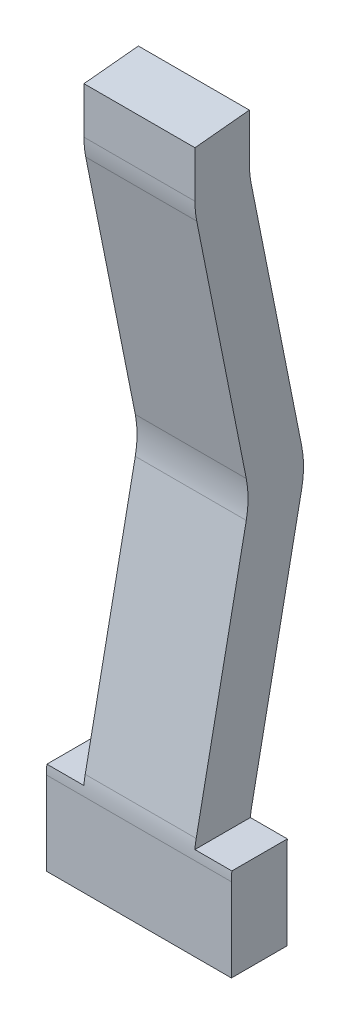
ISO-10303-21;
HEADER;
FILE_DESCRIPTION(('STEP AP214'),'2;1');
FILE_NAME('part.step','',(''),(''),'','','');
FILE_SCHEMA(('AUTOMOTIVE_DESIGN { 1 0 10303 214 1 1 1 1 }'));
ENDSEC;
DATA;
#1=APPLICATION_CONTEXT('core data for automotive mechanical design processes');
#2=APPLICATION_PROTOCOL_DEFINITION('international standard','automotive_design',2000,#1);
#3=PRODUCT_CONTEXT('',#1,'mechanical');
#4=PRODUCT('Part','Part','',(#3));
#5=PRODUCT_RELATED_PRODUCT_CATEGORY('part','',(#4));
#6=PRODUCT_DEFINITION_FORMATION('','',#4);
#7=PRODUCT_DEFINITION_CONTEXT('part definition',#1,'design');
#8=PRODUCT_DEFINITION('design','',#6,#7);
#9=PRODUCT_DEFINITION_SHAPE('','',#8);
#10=(LENGTH_UNIT() NAMED_UNIT(*) SI_UNIT(.MILLI.,.METRE.));
#11=(NAMED_UNIT(*) PLANE_ANGLE_UNIT() SI_UNIT($,.RADIAN.));
#12=(NAMED_UNIT(*) SI_UNIT($,.STERADIAN.) SOLID_ANGLE_UNIT());
#13=UNCERTAINTY_MEASURE_WITH_UNIT(LENGTH_MEASURE(1.E-05),#10,'distance_accuracy_value','');
#14=(GEOMETRIC_REPRESENTATION_CONTEXT(3) GLOBAL_UNCERTAINTY_ASSIGNED_CONTEXT((#13)) GLOBAL_UNIT_ASSIGNED_CONTEXT((#10,
#11,#12)) REPRESENTATION_CONTEXT('',''));
#15=CARTESIAN_POINT('',(0.,0.,0.));
#16=DIRECTION('',(0.,0.,1.));
#17=DIRECTION('',(1.,0.,0.));
#18=AXIS2_PLACEMENT_3D('',#15,#16,#17);
#19=CARTESIAN_POINT('',(0.4,0.450490243203608,-0.35));
#20=DIRECTION('',(1.,0.,0.));
#21=DIRECTION('',(0.,0.0985376179666422,0.99513332666807));
#22=AXIS2_PLACEMENT_3D('',#19,#20,#21);
#23=CYLINDRICAL_SURFACE('',#22,0.5);
#24=CARTESIAN_POINT('',(-0.3,0.450490243203608,-0.35));
#25=DIRECTION('',(-1.,0.,0.));
#26=DIRECTION('',(0.,0.0985376179666422,0.99513332666807));
#27=AXIS2_PLACEMENT_3D('',#24,#25,#26);
#28=CIRCLE('',#27,0.5);
#29=CARTESIAN_POINT('',(-0.3,0.5,0.147542745884173));
#30=VERTEX_POINT('',#29);
#31=CARTESIAN_POINT('',(-0.3,0.5485483107727,0.14029033784546));
#32=VERTEX_POINT('',#31);
#33=EDGE_CURVE('E308',#30,#32,#28,.T.);
#34=ORIENTED_EDGE('',*,*,#33,.F.);
#35=DIRECTION('',(1.,0.,0.));
#36=VECTOR('',#35,1.);
#37=CARTESIAN_POINT('',(0.4,0.5,0.147542745884173));
#38=LINE('',#37,#36);
#39=CARTESIAN_POINT('',(-0.5,0.5,0.147542745884173));
#40=VERTEX_POINT('',#39);
#41=EDGE_CURVE('E40',#40,#30,#38,.T.);
#42=ORIENTED_EDGE('',*,*,#41,.F.);
#43=CARTESIAN_POINT('',(-0.5,0.450490243203608,-0.35));
#44=DIRECTION('',(-1.,0.,0.));
#45=DIRECTION('',(0.,0.0985376179666422,0.99513332666807));
#46=AXIS2_PLACEMENT_3D('',#43,#44,#45);
#47=CIRCLE('',#46,0.5);
#48=CARTESIAN_POINT('',(-0.5,0.450490243203608,0.15));
#49=VERTEX_POINT('',#48);
#50=EDGE_CURVE('E224',#49,#40,#47,.T.);
#51=ORIENTED_EDGE('',*,*,#50,.F.);
#52=DIRECTION('',(-1.,0.,0.));
#53=VECTOR('',#52,1.);
#54=CARTESIAN_POINT('',(0.4,0.450490243203608,0.15));
#55=LINE('',#54,#53);
#56=CARTESIAN_POINT('',(0.5,0.450490243203608,0.15));
#57=VERTEX_POINT('',#56);
#58=EDGE_CURVE('E331',#57,#49,#55,.T.);
#59=ORIENTED_EDGE('',*,*,#58,.F.);
#60=CARTESIAN_POINT('',(0.5,0.450490243203608,-0.35));
#61=DIRECTION('',(1.,0.,0.));
#62=DIRECTION('',(0.,0.0985376179666422,0.99513332666807));
#63=AXIS2_PLACEMENT_3D('',#60,#61,#62);
#64=CIRCLE('',#63,0.5);
#65=CARTESIAN_POINT('',(0.5,0.5,0.147542745884173));
#66=VERTEX_POINT('',#65);
#67=EDGE_CURVE('E279',#66,#57,#64,.T.);
#68=ORIENTED_EDGE('',*,*,#67,.F.);
#69=DIRECTION('',(1.,0.,0.));
#70=VECTOR('',#69,1.);
#71=CARTESIAN_POINT('',(0.4,0.5,0.147542745884173));
#72=LINE('',#71,#70);
#73=CARTESIAN_POINT('',(0.3,0.5,0.147542745884173));
#74=VERTEX_POINT('',#73);
#75=EDGE_CURVE('E11',#74,#66,#72,.T.);
#76=ORIENTED_EDGE('',*,*,#75,.F.);
#77=CARTESIAN_POINT('',(0.3,0.450490243203608,-0.35));
#78=DIRECTION('',(1.,0.,0.));
#79=DIRECTION('',(0.,0.0985376179666422,0.99513332666807));
#80=AXIS2_PLACEMENT_3D('',#77,#78,#79);
#81=CIRCLE('',#80,0.5);
#82=CARTESIAN_POINT('',(0.3,0.5485483107727,0.140290337845461));
#83=VERTEX_POINT('',#82);
#84=EDGE_CURVE('E20',#83,#74,#81,.T.);
#85=ORIENTED_EDGE('',*,*,#84,.F.);
#86=DIRECTION('',(1.,0.,0.));
#87=VECTOR('',#86,1.);
#88=CARTESIAN_POINT('',(0.4,0.5485483107727,0.140290337845461));
#89=LINE('',#88,#87);
#90=EDGE_CURVE('E266',#32,#83,#89,.T.);
#91=ORIENTED_EDGE('',*,*,#90,.F.);
#92=EDGE_LOOP('',(#34,#42,#51,#59,#68,#76,#85,#91));
#93=FACE_BOUND('',#92,.T.);
#94=ADVANCED_FACE('F16',(#93),#23,.T.);
#95=CARTESIAN_POINT('',(0.,0.5,0.));
#96=DIRECTION('',(0.,-1.,0.));
#97=DIRECTION('',(0.,0.,-1.));
#98=AXIS2_PLACEMENT_3D('',#95,#96,#97);
#99=PLANE('',#98);
#100=ORIENTED_EDGE('',*,*,#75,.T.);
#101=DIRECTION('',(0.,0.,1.));
#102=VECTOR('',#101,1.);
#103=CARTESIAN_POINT('',(0.5,0.5,-0.075));
#104=LINE('',#103,#102);
#105=CARTESIAN_POINT('',(0.5,0.5,-0.152457254115828));
#106=VERTEX_POINT('',#105);
#107=EDGE_CURVE('E175',#106,#66,#104,.T.);
#108=ORIENTED_EDGE('',*,*,#107,.F.);
#109=DIRECTION('',(1.,0.,0.));
#110=VECTOR('',#109,1.);
#111=CARTESIAN_POINT('',(-0.4,0.5,-0.152457254115828));
#112=LINE('',#111,#110);
#113=CARTESIAN_POINT('',(0.3,0.5,-0.152457254115828));
#114=VERTEX_POINT('',#113);
#115=EDGE_CURVE('E179',#114,#106,#112,.T.);
#116=ORIENTED_EDGE('',*,*,#115,.F.);
#117=DIRECTION('',(0.,0.,-1.));
#118=VECTOR('',#117,1.);
#119=CARTESIAN_POINT('',(0.3,0.5,-0.075));
#120=LINE('',#119,#118);
#121=EDGE_CURVE('E364',#74,#114,#120,.T.);
#122=ORIENTED_EDGE('',*,*,#121,.F.);
#123=EDGE_LOOP('',(#100,#108,#116,#122));
#124=FACE_BOUND('',#123,.T.);
#125=ADVANCED_FACE('F177',(#124),#99,.F.);
#126=CARTESIAN_POINT('',(0.3,0.5,-0.15));
#127=DIRECTION('',(-1.,0.,0.));
#128=DIRECTION('',(0.,0.,1.));
#129=AXIS2_PLACEMENT_3D('',#126,#127,#128);
#130=PLANE('',#129);
#131=ORIENTED_EDGE('',*,*,#84,.T.);
#132=ORIENTED_EDGE('',*,*,#121,.T.);
#133=CARTESIAN_POINT('',(0.3,0.450490243203603,-0.65));
#134=DIRECTION('',(-1.,0.,0.));
#135=DIRECTION('',(0.,0.0985376179666422,0.99513332666807));
#136=AXIS2_PLACEMENT_3D('',#133,#134,#135);
#137=CIRCLE('',#136,0.5);
#138=CARTESIAN_POINT('',(0.3,0.548548310772695,-0.159709662154539));
#139=VERTEX_POINT('',#138);
#140=EDGE_CURVE('E193',#114,#139,#137,.T.);
#141=ORIENTED_EDGE('',*,*,#140,.T.);
#142=DIRECTION('',(0.,0.98058067569092,-0.196116135138184));
#143=VECTOR('',#142,1.);
#144=CARTESIAN_POINT('',(0.3,0.5,-0.15));
#145=LINE('',#144,#143);
#146=CARTESIAN_POINT('',(0.3,1.90194193243091,-0.430388386486182));
#147=VERTEX_POINT('',#146);
#148=EDGE_CURVE('E343',#139,#147,#145,.T.);
#149=ORIENTED_EDGE('',*,*,#148,.T.);
#150=CARTESIAN_POINT('',(0.3,2.,0.059901951359278));
#151=DIRECTION('',(1.,0.,0.));
#152=DIRECTION('',(0.,0.,-1.));
#153=AXIS2_PLACEMENT_3D('',#150,#151,#152);
#154=CIRCLE('',#153,0.5);
#155=CARTESIAN_POINT('',(0.3,2.09805806756909,-0.430388386486182));
#156=VERTEX_POINT('',#155);
#157=EDGE_CURVE('E339',#147,#156,#154,.T.);
#158=ORIENTED_EDGE('',*,*,#157,.T.);
#159=DIRECTION('',(0.,0.98058067569092,0.196116135138184));
#160=VECTOR('',#159,1.);
#161=CARTESIAN_POINT('',(0.3,2.,-0.45));
#162=LINE('',#161,#160);
#163=CARTESIAN_POINT('',(0.3,3.46601618245911,-0.156796763508179));
#164=VERTEX_POINT('',#163);
#165=EDGE_CURVE('E344',#156,#164,#162,.T.);
#166=ORIENTED_EDGE('',*,*,#165,.T.);
#167=CARTESIAN_POINT('',(0.3,3.5640742500282,-0.647087101353638));
#168=DIRECTION('',(-1.,0.,0.));
#169=DIRECTION('',(0.,-0.0985376179666424,0.99513332666807));
#170=AXIS2_PLACEMENT_3D('',#167,#168,#169);
#171=CIRCLE('',#170,0.5);
#172=CARTESIAN_POINT('',(0.3,3.5640742500282,-0.147087101353639));
#173=VERTEX_POINT('',#172);
#174=EDGE_CURVE('E292',#164,#173,#171,.T.);
#175=ORIENTED_EDGE('',*,*,#174,.T.);
#176=DIRECTION('',(0.,1.,0.));
#177=VECTOR('',#176,1.);
#178=CARTESIAN_POINT('',(0.3,3.51456449323181,-0.147087101353639));
#179=LINE('',#178,#177);
#180=CARTESIAN_POINT('',(0.3,3.81456449323181,-0.147087101353639));
#181=VERTEX_POINT('',#180);
#182=EDGE_CURVE('E288',#173,#181,#179,.T.);
#183=ORIENTED_EDGE('',*,*,#182,.T.);
#184=DIRECTION('',(0.,-0.0985376179666421,0.99513332666807));
#185=VECTOR('',#184,1.);
#186=CARTESIAN_POINT('',(0.3,3.81478081858714,-0.14927177533841));
#187=LINE('',#186,#185);
#188=CARTESIAN_POINT('',(0.3,3.78543550676819,0.147087101353638));
#189=VERTEX_POINT('',#188);
#190=EDGE_CURVE('E293',#181,#189,#187,.T.);
#191=ORIENTED_EDGE('',*,*,#190,.T.);
#192=DIRECTION('',(0.,1.,0.));
#193=VECTOR('',#192,1.);
#194=CARTESIAN_POINT('',(0.3,3.48543550676819,0.147087101353638));
#195=LINE('',#194,#193);
#196=CARTESIAN_POINT('',(0.3,3.53494526356458,0.147087101353638));
#197=VERTEX_POINT('',#196);
#198=EDGE_CURVE('E223',#197,#189,#195,.T.);
#199=ORIENTED_EDGE('',*,*,#198,.F.);
#200=CARTESIAN_POINT('',(0.3,3.53494526356458,-0.352912898646361));
#201=DIRECTION('',(1.,0.,0.));
#202=DIRECTION('',(0.,-0.0985376179666424,0.99513332666807));
#203=AXIS2_PLACEMENT_3D('',#200,#201,#202);
#204=CIRCLE('',#203,0.5);
#205=CARTESIAN_POINT('',(0.3,3.43688719599549,0.137377439199099));
#206=VERTEX_POINT('',#205);
#207=EDGE_CURVE('E283',#197,#206,#204,.T.);
#208=ORIENTED_EDGE('',*,*,#207,.T.);
#209=DIRECTION('',(0.,0.98058067569092,0.196116135138184));
#210=VECTOR('',#209,1.);
#211=CARTESIAN_POINT('',(0.3,2.,-0.15));
#212=LINE('',#211,#210);
#213=CARTESIAN_POINT('',(0.3,2.09805806756909,-0.130388386486181));
#214=VERTEX_POINT('',#213);
#215=EDGE_CURVE('E261',#214,#206,#212,.T.);
#216=ORIENTED_EDGE('',*,*,#215,.F.);
#217=CARTESIAN_POINT('',(0.3,2.,0.359901951359279));
#218=DIRECTION('',(-1.,0.,0.));
#219=DIRECTION('',(0.,0.,-1.));
#220=AXIS2_PLACEMENT_3D('',#217,#218,#219);
#221=CIRCLE('',#220,0.5);
#222=CARTESIAN_POINT('',(0.3,1.90194193243091,-0.130388386486181));
#223=VERTEX_POINT('',#222);
#224=EDGE_CURVE('E270',#214,#223,#221,.T.);
#225=ORIENTED_EDGE('',*,*,#224,.T.);
#226=DIRECTION('',(0.,0.98058067569092,-0.196116135138184));
#227=VECTOR('',#226,1.);
#228=CARTESIAN_POINT('',(0.3,0.5,0.15));
#229=LINE('',#228,#227);
#230=EDGE_CURVE('E271',#83,#223,#229,.T.);
#231=ORIENTED_EDGE('',*,*,#230,.F.);
#232=EDGE_LOOP('',(#131,#132,#141,#149,#158,#166,#175,#183,#191,#199,#208,#216,#225,#231));
#233=FACE_BOUND('',#232,.T.);
#234=ADVANCED_FACE('F396',(#233),#130,.F.);
#235=CARTESIAN_POINT('',(0.3,0.5,0.15));
#236=DIRECTION('',(0.,-0.196116135138184,-0.98058067569092));
#237=DIRECTION('',(0.,-0.98058067569092,0.196116135138184));
#238=AXIS2_PLACEMENT_3D('',#235,#236,#237);
#239=PLANE('',#238);
#240=ORIENTED_EDGE('',*,*,#90,.T.);
#241=ORIENTED_EDGE('',*,*,#230,.T.);
#242=DIRECTION('',(-1.,0.,0.));
#243=VECTOR('',#242,1.);
#244=CARTESIAN_POINT('',(0.3,1.90194193243091,-0.130388386486181));
#245=LINE('',#244,#243);
#246=CARTESIAN_POINT('',(-0.3,1.90194193243091,-0.130388386486181));
#247=VERTEX_POINT('',#246);
#248=EDGE_CURVE('E318',#223,#247,#245,.T.);
#249=ORIENTED_EDGE('',*,*,#248,.T.);
#250=DIRECTION('',(0.,0.98058067569092,-0.196116135138184));
#251=VECTOR('',#250,1.);
#252=CARTESIAN_POINT('',(-0.3,0.5,0.15));
#253=LINE('',#252,#251);
#254=EDGE_CURVE('E305',#32,#247,#253,.T.);
#255=ORIENTED_EDGE('',*,*,#254,.F.);
#256=EDGE_LOOP('',(#240,#241,#249,#255));
#257=FACE_BOUND('',#256,.T.);
#258=ADVANCED_FACE('F414',(#257),#239,.F.);
#259=CARTESIAN_POINT('',(-0.3,0.5,0.15));
#260=DIRECTION('',(1.,0.,0.));
#261=DIRECTION('',(0.,0.,1.));
#262=AXIS2_PLACEMENT_3D('',#259,#260,#261);
#263=PLANE('',#262);
#264=ORIENTED_EDGE('',*,*,#33,.T.);
#265=ORIENTED_EDGE('',*,*,#254,.T.);
#266=CARTESIAN_POINT('',(-0.3,2.,0.359901951359279));
#267=DIRECTION('',(1.,0.,0.));
#268=DIRECTION('',(0.,0.,-1.));
#269=AXIS2_PLACEMENT_3D('',#266,#267,#268);
#270=CIRCLE('',#269,0.5);
#271=CARTESIAN_POINT('',(-0.3,2.09805806756909,-0.130388386486181));
#272=VERTEX_POINT('',#271);
#273=EDGE_CURVE('E303',#247,#272,#270,.T.);
#274=ORIENTED_EDGE('',*,*,#273,.T.);
#275=DIRECTION('',(0.,0.98058067569092,0.196116135138184));
#276=VECTOR('',#275,1.);
#277=CARTESIAN_POINT('',(-0.3,2.,-0.15));
#278=LINE('',#277,#276);
#279=CARTESIAN_POINT('',(-0.3,3.43688719599549,0.137377439199098));
#280=VERTEX_POINT('',#279);
#281=EDGE_CURVE('E299',#272,#280,#278,.T.);
#282=ORIENTED_EDGE('',*,*,#281,.T.);
#283=CARTESIAN_POINT('',(-0.3,3.53494526356458,-0.352912898646361));
#284=DIRECTION('',(-1.,0.,0.));
#285=DIRECTION('',(0.,-0.0985376179666424,0.99513332666807));
#286=AXIS2_PLACEMENT_3D('',#283,#284,#285);
#287=CIRCLE('',#286,0.5);
#288=CARTESIAN_POINT('',(-0.3,3.53494526356458,0.147087101353638));
#289=VERTEX_POINT('',#288);
#290=EDGE_CURVE('E304',#280,#289,#287,.T.);
#291=ORIENTED_EDGE('',*,*,#290,.T.);
#292=DIRECTION('',(0.,1.,0.));
#293=VECTOR('',#292,1.);
#294=CARTESIAN_POINT('',(-0.3,3.48543550676819,0.147087101353638));
#295=LINE('',#294,#293);
#296=CARTESIAN_POINT('',(-0.3,3.78543550676819,0.147087101353638));
#297=VERTEX_POINT('',#296);
#298=EDGE_CURVE('E354',#289,#297,#295,.T.);
#299=ORIENTED_EDGE('',*,*,#298,.T.);
#300=DIRECTION('',(0.,0.0985376179666421,-0.99513332666807));
#301=VECTOR('',#300,1.);
#302=CARTESIAN_POINT('',(-0.3,3.80007210845178,-0.000728224661590161));
#303=LINE('',#302,#301);
#304=CARTESIAN_POINT('',(-0.3,3.81456449323181,-0.147087101353639));
#305=VERTEX_POINT('',#304);
#306=EDGE_CURVE('E276',#297,#305,#303,.T.);
#307=ORIENTED_EDGE('',*,*,#306,.T.);
#308=DIRECTION('',(0.,1.,0.));
#309=VECTOR('',#308,1.);
#310=CARTESIAN_POINT('',(-0.3,3.51456449323181,-0.147087101353639));
#311=LINE('',#310,#309);
#312=CARTESIAN_POINT('',(-0.3,3.5640742500282,-0.147087101353639));
#313=VERTEX_POINT('',#312);
#314=EDGE_CURVE('E335',#313,#305,#311,.T.);
#315=ORIENTED_EDGE('',*,*,#314,.F.);
#316=CARTESIAN_POINT('',(-0.3,3.5640742500282,-0.647087101353639));
#317=DIRECTION('',(1.,0.,0.));
#318=DIRECTION('',(0.,-0.0985376179666424,0.99513332666807));
#319=AXIS2_PLACEMENT_3D('',#316,#317,#318);
#320=CIRCLE('',#319,0.5);
#321=CARTESIAN_POINT('',(-0.3,3.46601618245911,-0.156796763508179));
#322=VERTEX_POINT('',#321);
#323=EDGE_CURVE('E272',#313,#322,#320,.T.);
#324=ORIENTED_EDGE('',*,*,#323,.T.);
#325=DIRECTION('',(0.,0.98058067569092,0.196116135138184));
#326=VECTOR('',#325,1.);
#327=CARTESIAN_POINT('',(-0.3,2.,-0.45));
#328=LINE('',#327,#326);
#329=CARTESIAN_POINT('',(-0.3,2.09805806756909,-0.430388386486182));
#330=VERTEX_POINT('',#329);
#331=EDGE_CURVE('E222',#330,#322,#328,.T.);
#332=ORIENTED_EDGE('',*,*,#331,.F.);
#333=CARTESIAN_POINT('',(-0.3,2.,0.0599019513592779));
#334=DIRECTION('',(-1.,0.,0.));
#335=DIRECTION('',(0.,0.,-1.));
#336=AXIS2_PLACEMENT_3D('',#333,#334,#335);
#337=CIRCLE('',#336,0.5);
#338=CARTESIAN_POINT('',(-0.3,1.90194193243091,-0.430388386486182));
#339=VERTEX_POINT('',#338);
#340=EDGE_CURVE('E195',#330,#339,#337,.T.);
#341=ORIENTED_EDGE('',*,*,#340,.T.);
#342=DIRECTION('',(0.,0.98058067569092,-0.196116135138184));
#343=VECTOR('',#342,1.);
#344=CARTESIAN_POINT('',(-0.3,0.5,-0.15));
#345=LINE('',#344,#343);
#346=CARTESIAN_POINT('',(-0.3,0.548548310772695,-0.159709662154539));
#347=VERTEX_POINT('',#346);
#348=EDGE_CURVE('E367',#347,#339,#345,.T.);
#349=ORIENTED_EDGE('',*,*,#348,.F.);
#350=CARTESIAN_POINT('',(-0.3,0.450490243203603,-0.65));
#351=DIRECTION('',(-1.,0.,0.));
#352=DIRECTION('',(0.,0.0985376179666422,0.99513332666807));
#353=AXIS2_PLACEMENT_3D('',#350,#351,#352);
#354=CIRCLE('',#353,0.5);
#355=CARTESIAN_POINT('',(-0.3,0.5,-0.152457254115828));
#356=VERTEX_POINT('',#355);
#357=EDGE_CURVE('E231',#356,#347,#354,.T.);
#358=ORIENTED_EDGE('',*,*,#357,.F.);
#359=DIRECTION('',(0.,0.,-1.));
#360=VECTOR('',#359,1.);
#361=CARTESIAN_POINT('',(-0.3,0.5,0.075));
#362=LINE('',#361,#360);
#363=EDGE_CURVE('E230',#30,#356,#362,.T.);
#364=ORIENTED_EDGE('',*,*,#363,.F.);
#365=EDGE_LOOP('',(#264,#265,#274,#282,#291,#299,#307,#315,#324,#332,#341,#349,#358,#364));
#366=FACE_BOUND('',#365,.T.);
#367=ADVANCED_FACE('F459',(#366),#263,.F.);
#368=CARTESIAN_POINT('',(-0.4,0.450490243203603,-0.65));
#369=DIRECTION('',(-1.,0.,0.));
#370=DIRECTION('',(0.,0.0985376179666422,0.99513332666807));
#371=AXIS2_PLACEMENT_3D('',#368,#369,#370);
#372=CYLINDRICAL_SURFACE('',#371,0.5);
#373=ORIENTED_EDGE('',*,*,#140,.F.);
#374=ORIENTED_EDGE('',*,*,#115,.T.);
#375=CARTESIAN_POINT('',(0.5,0.450490243203603,-0.65));
#376=DIRECTION('',(-1.,0.,0.));
#377=DIRECTION('',(0.,0.0985376179666422,0.99513332666807));
#378=AXIS2_PLACEMENT_3D('',#375,#376,#377);
#379=CIRCLE('',#378,0.5);
#380=CARTESIAN_POINT('',(0.5,0.450490243203603,-0.15));
#381=VERTEX_POINT('',#380);
#382=EDGE_CURVE('E185',#381,#106,#379,.T.);
#383=ORIENTED_EDGE('',*,*,#382,.F.);
#384=DIRECTION('',(1.,0.,0.));
#385=VECTOR('',#384,1.);
#386=CARTESIAN_POINT('',(-0.4,0.450490243203603,-0.15));
#387=LINE('',#386,#385);
#388=CARTESIAN_POINT('',(-0.5,0.450490243203603,-0.15));
#389=VERTEX_POINT('',#388);
#390=EDGE_CURVE('E234',#389,#381,#387,.T.);
#391=ORIENTED_EDGE('',*,*,#390,.F.);
#392=CARTESIAN_POINT('',(-0.5,0.450490243203603,-0.65));
#393=DIRECTION('',(-1.,0.,0.));
#394=DIRECTION('',(0.,0.0985376179666422,0.99513332666807));
#395=AXIS2_PLACEMENT_3D('',#392,#393,#394);
#396=CIRCLE('',#395,0.5);
#397=CARTESIAN_POINT('',(-0.5,0.5,-0.152457254115828));
#398=VERTEX_POINT('',#397);
#399=EDGE_CURVE('E196',#389,#398,#396,.T.);
#400=ORIENTED_EDGE('',*,*,#399,.T.);
#401=DIRECTION('',(-1.,0.,0.));
#402=VECTOR('',#401,1.);
#403=CARTESIAN_POINT('',(-0.4,0.5,-0.152457254115828));
#404=LINE('',#403,#402);
#405=EDGE_CURVE('E227',#356,#398,#404,.T.);
#406=ORIENTED_EDGE('',*,*,#405,.F.);
#407=ORIENTED_EDGE('',*,*,#357,.T.);
#408=DIRECTION('',(-1.,0.,0.));
#409=VECTOR('',#408,1.);
#410=CARTESIAN_POINT('',(-0.4,0.548548310772695,-0.159709662154539));
#411=LINE('',#410,#409);
#412=EDGE_CURVE('E265',#139,#347,#411,.T.);
#413=ORIENTED_EDGE('',*,*,#412,.F.);
#414=EDGE_LOOP('',(#373,#374,#383,#391,#400,#406,#407,#413));
#415=FACE_BOUND('',#414,.T.);
#416=ADVANCED_FACE('F189',(#415),#372,.F.);
#417=CARTESIAN_POINT('',(-0.5,0.,-0.15));
#418=DIRECTION('',(0.,0.,1.));
#419=DIRECTION('',(1.,0.,0.));
#420=AXIS2_PLACEMENT_3D('',#417,#418,#419);
#421=PLANE('',#420);
#422=ORIENTED_EDGE('',*,*,#390,.T.);
#423=DIRECTION('',(0.,1.,0.));
#424=VECTOR('',#423,1.);
#425=CARTESIAN_POINT('',(0.5,0.,-0.15));
#426=LINE('',#425,#424);
#427=CARTESIAN_POINT('',(0.5,0.,-0.15));
#428=VERTEX_POINT('',#427);
#429=EDGE_CURVE('E201',#428,#381,#426,.T.);
#430=ORIENTED_EDGE('',*,*,#429,.F.);
#431=DIRECTION('',(-1.,0.,0.));
#432=VECTOR('',#431,1.);
#433=CARTESIAN_POINT('',(0.5,0.,-0.15));
#434=LINE('',#433,#432);
#435=CARTESIAN_POINT('',(-0.5,0.,-0.15));
#436=VERTEX_POINT('',#435);
#437=EDGE_CURVE('E244',#428,#436,#434,.T.);
#438=ORIENTED_EDGE('',*,*,#437,.T.);
#439=DIRECTION('',(0.,1.,0.));
#440=VECTOR('',#439,1.);
#441=CARTESIAN_POINT('',(-0.5,0.,-0.15));
#442=LINE('',#441,#440);
#443=EDGE_CURVE('E216',#436,#389,#442,.T.);
#444=ORIENTED_EDGE('',*,*,#443,.T.);
#445=EDGE_LOOP('',(#422,#430,#438,#444));
#446=FACE_BOUND('',#445,.T.);
#447=ADVANCED_FACE('F458',(#446),#421,.F.);
#448=CARTESIAN_POINT('',(-0.3,3.5640742500282,-0.647087101353639));
#449=DIRECTION('',(-1.,0.,0.));
#450=DIRECTION('',(0.,-0.0985376179666424,0.99513332666807));
#451=AXIS2_PLACEMENT_3D('',#448,#449,#450);
#452=CYLINDRICAL_SURFACE('',#451,0.5);
#453=ORIENTED_EDGE('',*,*,#323,.F.);
#454=DIRECTION('',(-1.,0.,0.));
#455=VECTOR('',#454,1.);
#456=CARTESIAN_POINT('',(-0.3,3.5640742500282,-0.147087101353639));
#457=LINE('',#456,#455);
#458=EDGE_CURVE('E315',#173,#313,#457,.T.);
#459=ORIENTED_EDGE('',*,*,#458,.F.);
#460=ORIENTED_EDGE('',*,*,#174,.F.);
#461=DIRECTION('',(1.,0.,0.));
#462=VECTOR('',#461,1.);
#463=CARTESIAN_POINT('',(-0.3,3.46601618245911,-0.156796763508178));
#464=LINE('',#463,#462);
#465=EDGE_CURVE('E212',#322,#164,#464,.T.);
#466=ORIENTED_EDGE('',*,*,#465,.F.);
#467=EDGE_LOOP('',(#453,#459,#460,#466));
#468=FACE_BOUND('',#467,.T.);
#469=ADVANCED_FACE('F495',(#468),#452,.F.);
#470=CARTESIAN_POINT('',(-0.3,2.,-0.45));
#471=DIRECTION('',(0.,-0.196116135138184,0.98058067569092));
#472=DIRECTION('',(-1.,0.,0.));
#473=AXIS2_PLACEMENT_3D('',#470,#471,#472);
#474=PLANE('',#473);
#475=ORIENTED_EDGE('',*,*,#465,.T.);
#476=ORIENTED_EDGE('',*,*,#165,.F.);
#477=DIRECTION('',(-1.,0.,0.));
#478=VECTOR('',#477,1.);
#479=CARTESIAN_POINT('',(-0.3,2.09805806756909,-0.430388386486182));
#480=LINE('',#479,#478);
#481=EDGE_CURVE('E217',#156,#330,#480,.T.);
#482=ORIENTED_EDGE('',*,*,#481,.T.);
#483=ORIENTED_EDGE('',*,*,#331,.T.);
#484=EDGE_LOOP('',(#475,#476,#482,#483));
#485=FACE_BOUND('',#484,.T.);
#486=ADVANCED_FACE('F491',(#485),#474,.F.);
#487=CARTESIAN_POINT('',(0.3,3.53494526356458,-0.352912898646361));
#488=DIRECTION('',(1.,0.,0.));
#489=DIRECTION('',(0.,-0.0985376179666424,0.99513332666807));
#490=AXIS2_PLACEMENT_3D('',#487,#488,#489);
#491=CYLINDRICAL_SURFACE('',#490,0.5);
#492=ORIENTED_EDGE('',*,*,#290,.F.);
#493=DIRECTION('',(-1.,0.,0.));
#494=VECTOR('',#493,1.);
#495=CARTESIAN_POINT('',(0.3,3.43688719599549,0.137377439199099));
#496=LINE('',#495,#494);
#497=EDGE_CURVE('E287',#206,#280,#496,.T.);
#498=ORIENTED_EDGE('',*,*,#497,.F.);
#499=ORIENTED_EDGE('',*,*,#207,.F.);
#500=DIRECTION('',(1.,0.,0.));
#501=VECTOR('',#500,1.);
#502=CARTESIAN_POINT('',(0.3,3.53494526356458,0.147087101353639));
#503=LINE('',#502,#501);
#504=EDGE_CURVE('E218',#289,#197,#503,.T.);
#505=ORIENTED_EDGE('',*,*,#504,.F.);
#506=EDGE_LOOP('',(#492,#498,#499,#505));
#507=FACE_BOUND('',#506,.T.);
#508=ADVANCED_FACE('F399',(#507),#491,.T.);
#509=CARTESIAN_POINT('',(0.3,3.48543550676819,0.147087101353639));
#510=DIRECTION('',(0.,0.,-1.));
#511=DIRECTION('',(0.,-1.,0.));
#512=AXIS2_PLACEMENT_3D('',#509,#510,#511);
#513=PLANE('',#512);
#514=ORIENTED_EDGE('',*,*,#504,.T.);
#515=ORIENTED_EDGE('',*,*,#198,.T.);
#516=DIRECTION('',(-1.,0.,0.));
#517=VECTOR('',#516,1.);
#518=CARTESIAN_POINT('',(0.15,3.78543550676819,0.147087101353638));
#519=LINE('',#518,#517);
#520=EDGE_CURVE('E296',#189,#297,#519,.T.);
#521=ORIENTED_EDGE('',*,*,#520,.T.);
#522=ORIENTED_EDGE('',*,*,#298,.F.);
#523=EDGE_LOOP('',(#514,#515,#521,#522));
#524=FACE_BOUND('',#523,.T.);
#525=ADVANCED_FACE('F445',(#524),#513,.F.);
#526=CARTESIAN_POINT('',(0.3,2.,0.359901951359279));
#527=DIRECTION('',(1.,0.,0.));
#528=DIRECTION('',(0.,0.,-1.));
#529=AXIS2_PLACEMENT_3D('',#526,#527,#528);
#530=CYLINDRICAL_SURFACE('',#529,0.5);
#531=ORIENTED_EDGE('',*,*,#224,.F.);
#532=DIRECTION('',(1.,0.,0.));
#533=VECTOR('',#532,1.);
#534=CARTESIAN_POINT('',(0.3,2.09805806756909,-0.130388386486181));
#535=LINE('',#534,#533);
#536=EDGE_CURVE('E264',#272,#214,#535,.T.);
#537=ORIENTED_EDGE('',*,*,#536,.F.);
#538=ORIENTED_EDGE('',*,*,#273,.F.);
#539=ORIENTED_EDGE('',*,*,#248,.F.);
#540=EDGE_LOOP('',(#531,#537,#538,#539));
#541=FACE_BOUND('',#540,.T.);
#542=ADVANCED_FACE('F408',(#541),#530,.F.);
#543=CARTESIAN_POINT('',(-0.3,2.,0.0599019513592779));
#544=DIRECTION('',(-1.,0.,0.));
#545=DIRECTION('',(0.,0.,-1.));
#546=AXIS2_PLACEMENT_3D('',#543,#544,#545);
#547=CYLINDRICAL_SURFACE('',#546,0.5);
#548=ORIENTED_EDGE('',*,*,#157,.F.);
#549=DIRECTION('',(1.,0.,0.));
#550=VECTOR('',#549,1.);
#551=CARTESIAN_POINT('',(-0.3,1.90194193243091,-0.430388386486182));
#552=LINE('',#551,#550);
#553=EDGE_CURVE('E256',#339,#147,#552,.T.);
#554=ORIENTED_EDGE('',*,*,#553,.F.);
#555=ORIENTED_EDGE('',*,*,#340,.F.);
#556=ORIENTED_EDGE('',*,*,#481,.F.);
#557=EDGE_LOOP('',(#548,#554,#555,#556));
#558=FACE_BOUND('',#557,.T.);
#559=ADVANCED_FACE('F422',(#558),#547,.T.);
#560=CARTESIAN_POINT('',(-0.3,3.51456449323181,-0.147087101353639));
#561=DIRECTION('',(0.,0.,1.));
#562=DIRECTION('',(1.,0.,0.));
#563=AXIS2_PLACEMENT_3D('',#560,#561,#562);
#564=PLANE('',#563);
#565=ORIENTED_EDGE('',*,*,#458,.T.);
#566=ORIENTED_EDGE('',*,*,#314,.T.);
#567=DIRECTION('',(1.,0.,0.));
#568=VECTOR('',#567,1.);
#569=CARTESIAN_POINT('',(-0.15,3.81456449323181,-0.147087101353639));
#570=LINE('',#569,#568);
#571=EDGE_CURVE('E332',#305,#181,#570,.T.);
#572=ORIENTED_EDGE('',*,*,#571,.T.);
#573=ORIENTED_EDGE('',*,*,#182,.F.);
#574=EDGE_LOOP('',(#565,#566,#572,#573));
#575=FACE_BOUND('',#574,.T.);
#576=ADVANCED_FACE('F427',(#575),#564,.F.);
#577=CARTESIAN_POINT('',(0.3,2.,-0.15));
#578=DIRECTION('',(0.,0.196116135138184,-0.98058067569092));
#579=DIRECTION('',(-1.,0.,0.));
#580=AXIS2_PLACEMENT_3D('',#577,#578,#579);
#581=PLANE('',#580);
#582=ORIENTED_EDGE('',*,*,#497,.T.);
#583=ORIENTED_EDGE('',*,*,#281,.F.);
#584=ORIENTED_EDGE('',*,*,#536,.T.);
#585=ORIENTED_EDGE('',*,*,#215,.T.);
#586=EDGE_LOOP('',(#582,#583,#584,#585));
#587=FACE_BOUND('',#586,.T.);
#588=ADVANCED_FACE('F401',(#587),#581,.F.);
#589=CARTESIAN_POINT('',(-0.3,0.5,-0.15));
#590=DIRECTION('',(0.,0.196116135138184,0.98058067569092));
#591=DIRECTION('',(1.,0.,0.));
#592=AXIS2_PLACEMENT_3D('',#589,#590,#591);
#593=PLANE('',#592);
#594=ORIENTED_EDGE('',*,*,#412,.T.);
#595=ORIENTED_EDGE('',*,*,#348,.T.);
#596=ORIENTED_EDGE('',*,*,#553,.T.);
#597=ORIENTED_EDGE('',*,*,#148,.F.);
#598=EDGE_LOOP('',(#594,#595,#596,#597));
#599=FACE_BOUND('',#598,.T.);
#600=ADVANCED_FACE('F472',(#599),#593,.F.);
#601=CARTESIAN_POINT('',(0.,3.8,0.));
#602=DIRECTION('',(0.,-0.99513332666807,-0.0985376179666421));
#603=DIRECTION('',(0.,0.0985376179666421,-0.99513332666807));
#604=AXIS2_PLACEMENT_3D('',#601,#602,#603);
#605=PLANE('',#604);
#606=ORIENTED_EDGE('',*,*,#571,.F.);
#607=ORIENTED_EDGE('',*,*,#306,.F.);
#608=ORIENTED_EDGE('',*,*,#520,.F.);
#609=ORIENTED_EDGE('',*,*,#190,.F.);
#610=EDGE_LOOP('',(#606,#607,#608,#609));
#611=FACE_BOUND('',#610,.T.);
#612=ADVANCED_FACE('F477',(#611),#605,.F.);
#613=CARTESIAN_POINT('',(0.,0.5,0.));
#614=DIRECTION('',(0.,-1.,0.));
#615=DIRECTION('',(0.,0.,-1.));
#616=AXIS2_PLACEMENT_3D('',#613,#614,#615);
#617=PLANE('',#616);
#618=ORIENTED_EDGE('',*,*,#41,.T.);
#619=ORIENTED_EDGE('',*,*,#363,.T.);
#620=ORIENTED_EDGE('',*,*,#405,.T.);
#621=DIRECTION('',(0.,0.,-1.));
#622=VECTOR('',#621,1.);
#623=CARTESIAN_POINT('',(-0.5,0.5,-0.15));
#624=LINE('',#623,#622);
#625=EDGE_CURVE('E228',#40,#398,#624,.T.);
#626=ORIENTED_EDGE('',*,*,#625,.F.);
#627=EDGE_LOOP('',(#618,#619,#620,#626));
#628=FACE_BOUND('',#627,.T.);
#629=ADVANCED_FACE('F439',(#628),#617,.F.);
#630=CARTESIAN_POINT('',(-0.5,0.,0.15));
#631=DIRECTION('',(1.,0.,0.));
#632=DIRECTION('',(0.,1.,0.));
#633=AXIS2_PLACEMENT_3D('',#630,#631,#632);
#634=PLANE('',#633);
#635=ORIENTED_EDGE('',*,*,#50,.T.);
#636=ORIENTED_EDGE('',*,*,#625,.T.);
#637=ORIENTED_EDGE('',*,*,#399,.F.);
#638=ORIENTED_EDGE('',*,*,#443,.F.);
#639=DIRECTION('',(0.,0.,1.));
#640=VECTOR('',#639,1.);
#641=CARTESIAN_POINT('',(-0.5,0.,-0.15));
#642=LINE('',#641,#640);
#643=CARTESIAN_POINT('',(-0.5,0.,0.15));
#644=VERTEX_POINT('',#643);
#645=EDGE_CURVE('E260',#436,#644,#642,.T.);
#646=ORIENTED_EDGE('',*,*,#645,.T.);
#647=DIRECTION('',(0.,1.,0.));
#648=VECTOR('',#647,1.);
#649=CARTESIAN_POINT('',(-0.5,0.,0.15));
#650=LINE('',#649,#648);
#651=EDGE_CURVE('E347',#644,#49,#650,.T.);
#652=ORIENTED_EDGE('',*,*,#651,.T.);
#653=EDGE_LOOP('',(#635,#636,#637,#638,#646,#652));
#654=FACE_BOUND('',#653,.T.);
#655=ADVANCED_FACE('F434',(#654),#634,.F.);
#656=CARTESIAN_POINT('',(0.5,0.,0.15));
#657=DIRECTION('',(0.,0.,-1.));
#658=DIRECTION('',(0.,-1.,0.));
#659=AXIS2_PLACEMENT_3D('',#656,#657,#658);
#660=PLANE('',#659);
#661=ORIENTED_EDGE('',*,*,#58,.T.);
#662=ORIENTED_EDGE('',*,*,#651,.F.);
#663=DIRECTION('',(1.,0.,0.));
#664=VECTOR('',#663,1.);
#665=CARTESIAN_POINT('',(-0.5,0.,0.15));
#666=LINE('',#665,#664);
#667=CARTESIAN_POINT('',(0.5,0.,0.15));
#668=VERTEX_POINT('',#667);
#669=EDGE_CURVE('E327',#644,#668,#666,.T.);
#670=ORIENTED_EDGE('',*,*,#669,.T.);
#671=DIRECTION('',(0.,1.,0.));
#672=VECTOR('',#671,1.);
#673=CARTESIAN_POINT('',(0.5,0.,0.15));
#674=LINE('',#673,#672);
#675=EDGE_CURVE('E321',#668,#57,#674,.T.);
#676=ORIENTED_EDGE('',*,*,#675,.T.);
#677=EDGE_LOOP('',(#661,#662,#670,#676));
#678=FACE_BOUND('',#677,.T.);
#679=ADVANCED_FACE('F438',(#678),#660,.F.);
#680=CARTESIAN_POINT('',(0.5,0.,-0.15));
#681=DIRECTION('',(-1.,0.,0.));
#682=DIRECTION('',(0.,0.,1.));
#683=AXIS2_PLACEMENT_3D('',#680,#681,#682);
#684=PLANE('',#683);
#685=ORIENTED_EDGE('',*,*,#67,.T.);
#686=ORIENTED_EDGE('',*,*,#675,.F.);
#687=DIRECTION('',(0.,0.,-1.));
#688=VECTOR('',#687,1.);
#689=CARTESIAN_POINT('',(0.5,0.,0.15));
#690=LINE('',#689,#688);
#691=EDGE_CURVE('E207',#668,#428,#690,.T.);
#692=ORIENTED_EDGE('',*,*,#691,.T.);
#693=ORIENTED_EDGE('',*,*,#429,.T.);
#694=ORIENTED_EDGE('',*,*,#382,.T.);
#695=ORIENTED_EDGE('',*,*,#107,.T.);
#696=EDGE_LOOP('',(#685,#686,#692,#693,#694,#695));
#697=FACE_BOUND('',#696,.T.);
#698=ADVANCED_FACE('F199',(#697),#684,.F.);
#699=CARTESIAN_POINT('',(0.,0.,0.));
#700=DIRECTION('',(0.,1.,0.));
#701=DIRECTION('',(1.,0.,0.));
#702=AXIS2_PLACEMENT_3D('',#699,#700,#701);
#703=PLANE('',#702);
#704=ORIENTED_EDGE('',*,*,#437,.F.);
#705=ORIENTED_EDGE('',*,*,#691,.F.);
#706=ORIENTED_EDGE('',*,*,#669,.F.);
#707=ORIENTED_EDGE('',*,*,#645,.F.);
#708=EDGE_LOOP('',(#704,#705,#706,#707));
#709=FACE_BOUND('',#708,.T.);
#710=ADVANCED_FACE('F18',(#709),#703,.F.);
#711=CLOSED_SHELL('',(#94,#125,#234,#258,#367,#416,#447,#469,#486,#508,#525,#542,#559,#576,#588,
#600,#612,#629,#655,#679,#698,#710));
#712=MANIFOLD_SOLID_BREP('B1',#711);
#713=ADVANCED_BREP_SHAPE_REPRESENTATION('',(#18,#712),#14);
#714=SHAPE_DEFINITION_REPRESENTATION(#9,#713);
ENDSEC;
END-ISO-10303-21;
